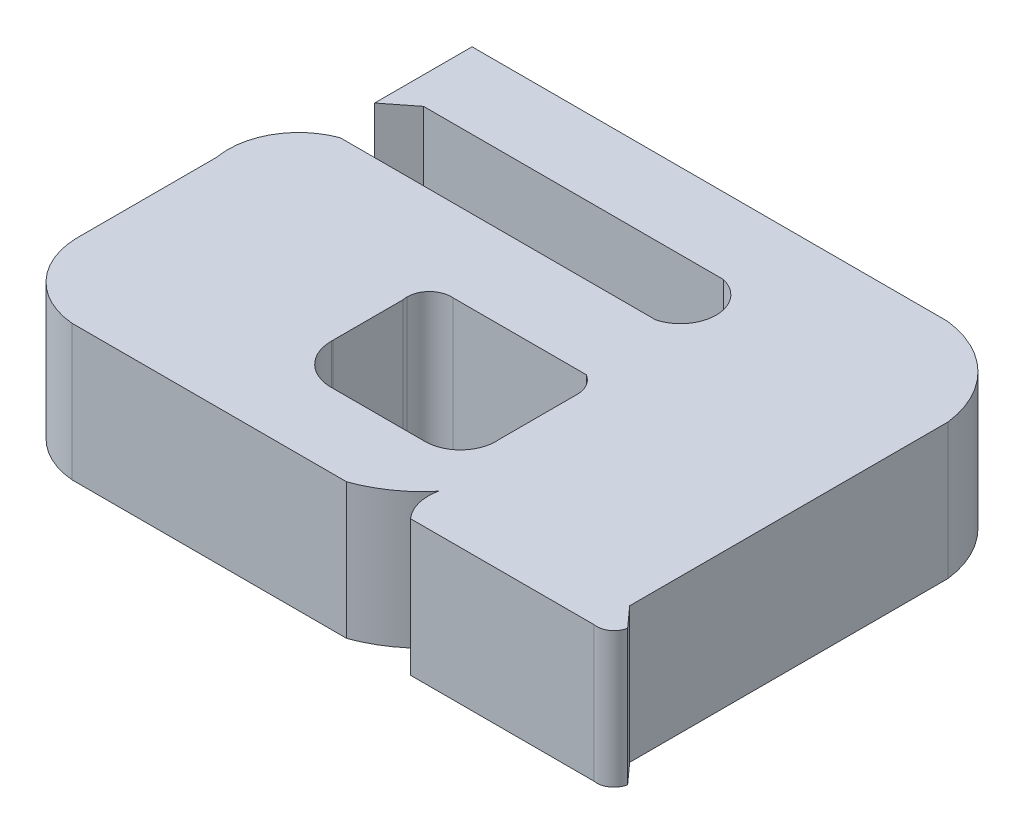
ISO-10303-21;
HEADER;
FILE_DESCRIPTION(('STEP AP214'),'2;1');
FILE_NAME('part.step','',(''),(''),'','','');
FILE_SCHEMA(('AUTOMOTIVE_DESIGN { 1 0 10303 214 1 1 1 1 }'));
ENDSEC;
DATA;
#1=APPLICATION_CONTEXT('core data for automotive mechanical design processes');
#2=APPLICATION_PROTOCOL_DEFINITION('international standard','automotive_design',2000,#1);
#3=PRODUCT_CONTEXT('',#1,'mechanical');
#4=PRODUCT('Part','Part','',(#3));
#5=PRODUCT_RELATED_PRODUCT_CATEGORY('part','',(#4));
#6=PRODUCT_DEFINITION_FORMATION('','',#4);
#7=PRODUCT_DEFINITION_CONTEXT('part definition',#1,'design');
#8=PRODUCT_DEFINITION('design','',#6,#7);
#9=PRODUCT_DEFINITION_SHAPE('','',#8);
#10=(LENGTH_UNIT() NAMED_UNIT(*) SI_UNIT(.MILLI.,.METRE.));
#11=(NAMED_UNIT(*) PLANE_ANGLE_UNIT() SI_UNIT($,.RADIAN.));
#12=(NAMED_UNIT(*) SI_UNIT($,.STERADIAN.) SOLID_ANGLE_UNIT());
#13=UNCERTAINTY_MEASURE_WITH_UNIT(LENGTH_MEASURE(1.E-05),#10,'distance_accuracy_value','');
#14=(GEOMETRIC_REPRESENTATION_CONTEXT(3) GLOBAL_UNCERTAINTY_ASSIGNED_CONTEXT((#13)) GLOBAL_UNIT_ASSIGNED_CONTEXT((#10,
#11,#12)) REPRESENTATION_CONTEXT('',''));
#15=CARTESIAN_POINT('',(0.,0.,0.));
#16=DIRECTION('',(0.,0.,1.));
#17=DIRECTION('',(1.,0.,0.));
#18=AXIS2_PLACEMENT_3D('',#15,#16,#17);
#19=CARTESIAN_POINT('',(64.5742558131211,66.7433443998356,55.477582362577));
#20=DIRECTION('',(0.,1.,0.));
#21=DIRECTION('',(1.,0.,0.));
#22=AXIS2_PLACEMENT_3D('',#19,#20,#21);
#23=PLANE('',#22);
#24=DIRECTION('',(0.,0.,1.));
#25=VECTOR('',#24,1.);
#26=CARTESIAN_POINT('',(65.6989900292125,66.7433443998356,54.5997265658926));
#27=LINE('',#26,#25);
#28=CARTESIAN_POINT('',(65.6989900292125,66.7433443998356,54.5997265658926));
#29=VERTEX_POINT('',#28);
#30=CARTESIAN_POINT('',(65.6989900292125,66.7433443998356,55.1674213470287));
#31=VERTEX_POINT('',#30);
#32=EDGE_CURVE('E383',#29,#31,#27,.T.);
#33=ORIENTED_EDGE('',*,*,#32,.T.);
#34=CARTESIAN_POINT('',(66.0241919260057,66.7433443998356,55.1819307169245));
#35=DIRECTION('',(0.,1.,0.));
#36=DIRECTION('',(1.,0.,0.));
#37=AXIS2_PLACEMENT_3D('',#34,#35,#36);
#38=CIRCLE('',#37,0.325525414510252);
#39=CARTESIAN_POINT('',(65.6986665114955,66.7433443998356,55.1819307169245));
#40=VERTEX_POINT('',#39);
#41=EDGE_CURVE('E290',#31,#40,#38,.T.);
#42=ORIENTED_EDGE('',*,*,#41,.T.);
#43=CARTESIAN_POINT('',(66.0241919260057,66.7433443998356,55.1819307169245));
#44=DIRECTION('',(0.,1.,0.));
#45=DIRECTION('',(1.,0.,0.));
#46=AXIS2_PLACEMENT_3D('',#43,#44,#45);
#47=CIRCLE('',#46,0.325525414510252);
#48=CARTESIAN_POINT('',(66.0447859383238,66.7433443998356,55.5068040493922));
#49=VERTEX_POINT('',#48);
#50=EDGE_CURVE('E11',#40,#49,#47,.T.);
#51=ORIENTED_EDGE('',*,*,#50,.T.);
#52=DIRECTION('',(1.,0.,0.));
#53=VECTOR('',#52,1.);
#54=CARTESIAN_POINT('',(66.0447859383171,66.7433443998356,55.5068040493935));
#55=LINE('',#54,#53);
#56=CARTESIAN_POINT('',(66.7672522095642,66.7433443998356,55.5068040493935));
#57=VERTEX_POINT('',#56);
#58=EDGE_CURVE('E452',#49,#57,#55,.T.);
#59=ORIENTED_EDGE('',*,*,#58,.T.);
#60=CARTESIAN_POINT('',(66.7820270991013,66.7433443998356,55.217643036085));
#61=DIRECTION('',(0.,1.,0.));
#62=DIRECTION('',(1.,0.,0.));
#63=AXIS2_PLACEMENT_3D('',#60,#61,#62);
#64=CIRCLE('',#63,0.289538234053463);
#65=CARTESIAN_POINT('',(67.0698236739014,66.7433443998356,55.1859330926573));
#66=VERTEX_POINT('',#65);
#67=EDGE_CURVE('E442',#57,#66,#64,.T.);
#68=ORIENTED_EDGE('',*,*,#67,.T.);
#69=DIRECTION('',(0.,0.,-1.));
#70=VECTOR('',#69,1.);
#71=CARTESIAN_POINT('',(67.0698236739005,66.7433443998356,55.1859330926564));
#72=LINE('',#71,#70);
#73=CARTESIAN_POINT('',(67.0698236739005,66.7433443998356,54.5750441385026));
#74=VERTEX_POINT('',#73);
#75=EDGE_CURVE('E426',#66,#74,#72,.T.);
#76=ORIENTED_EDGE('',*,*,#75,.T.);
#77=CARTESIAN_POINT('',(66.8608056031624,66.7433443998356,54.5627610008414));
#78=DIRECTION('',(0.,1.,0.));
#79=DIRECTION('',(1.,0.,0.));
#80=AXIS2_PLACEMENT_3D('',#77,#78,#79);
#81=CIRCLE('',#80,0.209378674574559);
#82=CARTESIAN_POINT('',(66.9693292347036,66.7433443998356,54.3837022094803));
#83=VERTEX_POINT('',#82);
#84=EDGE_CURVE('E414',#74,#83,#81,.T.);
#85=ORIENTED_EDGE('',*,*,#84,.T.);
#86=DIRECTION('',(-1.,0.,0.));
#87=VECTOR('',#86,1.);
#88=CARTESIAN_POINT('',(66.9693292347027,66.7433443998356,54.3837022094832));
#89=LINE('',#88,#87);
#90=CARTESIAN_POINT('',(65.8870951940925,66.7433443998356,54.3837022094832));
#91=VERTEX_POINT('',#90);
#92=EDGE_CURVE('E404',#83,#91,#89,.T.);
#93=ORIENTED_EDGE('',*,*,#92,.T.);
#94=CARTESIAN_POINT('',(65.874476109552,66.7433443998356,54.5626233435287));
#95=DIRECTION('',(0.,1.,0.));
#96=DIRECTION('',(1.,0.,0.));
#97=AXIS2_PLACEMENT_3D('',#94,#95,#96);
#98=CIRCLE('',#97,0.179365586171376);
#99=CARTESIAN_POINT('',(65.6951105233806,66.7433443998356,54.5626233435287));
#100=VERTEX_POINT('',#99);
#101=EDGE_CURVE('E342',#91,#100,#98,.T.);
#102=ORIENTED_EDGE('',*,*,#101,.T.);
#103=CARTESIAN_POINT('',(65.874476109552,66.7433443998356,54.5626233435287));
#104=DIRECTION('',(0.,1.,0.));
#105=DIRECTION('',(1.,0.,0.));
#106=AXIS2_PLACEMENT_3D('',#103,#104,#105);
#107=CIRCLE('',#106,0.179365586171376);
#108=EDGE_CURVE('E401',#100,#29,#107,.T.);
#109=ORIENTED_EDGE('',*,*,#108,.T.);
#110=EDGE_LOOP('',(#33,#42,#51,#59,#68,#76,#85,#93,#102,#109));
#111=FACE_BOUND('',#110,.T.);
#112=DIRECTION('',(0.,0.,1.));
#113=VECTOR('',#112,1.);
#114=CARTESIAN_POINT('',(63.9422102820271,66.7433443998356,54.3523550921747));
#115=LINE('',#114,#113);
#116=CARTESIAN_POINT('',(63.9422102820271,66.7433443998356,54.3523550921747));
#117=VERTEX_POINT('',#116);
#118=CARTESIAN_POINT('',(63.9422102820271,66.7433443998356,55.4965245743061));
#119=VERTEX_POINT('',#118);
#120=EDGE_CURVE('E472',#117,#119,#115,.T.);
#121=ORIENTED_EDGE('',*,*,#120,.F.);
#122=CARTESIAN_POINT('',(64.5033690507797,66.7433443998356,54.2518971534337));
#123=DIRECTION('',(0.,1.,0.));
#124=DIRECTION('',(1.,0.,0.));
#125=AXIS2_PLACEMENT_3D('',#122,#123,#124);
#126=CIRCLE('',#125,0.570079784940947);
#127=CARTESIAN_POINT('',(63.9332892658388,66.7433443998356,54.2518971534337));
#128=VERTEX_POINT('',#127);
#129=EDGE_CURVE('E337',#128,#117,#126,.T.);
#130=ORIENTED_EDGE('',*,*,#129,.F.);
#131=CARTESIAN_POINT('',(64.5033690507797,66.7433443998356,54.2518971534337));
#132=DIRECTION('',(0.,1.,0.));
#133=DIRECTION('',(1.,0.,0.));
#134=AXIS2_PLACEMENT_3D('',#131,#132,#133);
#135=CIRCLE('',#134,0.570079784940947);
#136=CARTESIAN_POINT('',(64.3063485343325,66.7433443998356,53.7169449337943));
#137=VERTEX_POINT('',#136);
#138=EDGE_CURVE('E19',#137,#128,#135,.T.);
#139=ORIENTED_EDGE('',*,*,#138,.F.);
#140=DIRECTION('',(-1.,0.,0.));
#141=VECTOR('',#140,1.);
#142=CARTESIAN_POINT('',(66.8653938516462,66.7433443998356,53.7169449337943));
#143=LINE('',#142,#141);
#144=CARTESIAN_POINT('',(66.8653938516475,66.7433443998356,53.7169449337941));
#145=VERTEX_POINT('',#144);
#146=EDGE_CURVE('E388',#145,#137,#143,.T.);
#147=ORIENTED_EDGE('',*,*,#146,.F.);
#148=CARTESIAN_POINT('',(66.7887857003995,66.7433443998356,53.4389638841001));
#149=DIRECTION('',(0.,-1.,0.));
#150=DIRECTION('',(1.,0.,0.));
#151=AXIS2_PLACEMENT_3D('',#148,#149,#150);
#152=CIRCLE('',#151,0.28834401819118);
#153=CARTESIAN_POINT('',(66.8555889512453,66.7433443998356,53.158465045417));
#154=VERTEX_POINT('',#153);
#155=EDGE_CURVE('E306',#154,#145,#152,.T.);
#156=ORIENTED_EDGE('',*,*,#155,.F.);
#157=DIRECTION('',(1.,0.,0.));
#158=VECTOR('',#157,1.);
#159=CARTESIAN_POINT('',(64.4240059355068,66.7433443998356,53.158465045417));
#160=LINE('',#159,#158);
#161=CARTESIAN_POINT('',(64.4240059355068,66.7433443998356,53.158465045417));
#162=VERTEX_POINT('',#161);
#163=EDGE_CURVE('E314',#162,#154,#160,.T.);
#164=ORIENTED_EDGE('',*,*,#163,.F.);
#165=DIRECTION('',(0.786213872145871,0.,-0.617954486386656));
#166=VECTOR('',#165,1.);
#167=CARTESIAN_POINT('',(64.2017485431093,66.7433443998356,53.3331566371461));
#168=LINE('',#167,#166);
#169=CARTESIAN_POINT('',(64.2017485431093,66.7433443998356,53.3331566371461));
#170=VERTEX_POINT('',#169);
#171=EDGE_CURVE('E352',#170,#162,#168,.T.);
#172=ORIENTED_EDGE('',*,*,#171,.F.);
#173=DIRECTION('',(0.,0.,1.));
#174=VECTOR('',#173,1.);
#175=CARTESIAN_POINT('',(64.2017485431093,66.7433443998356,52.5432437431418));
#176=LINE('',#175,#174);
#177=CARTESIAN_POINT('',(64.2017485431093,66.7433443998356,52.5432437431418));
#178=VERTEX_POINT('',#177);
#179=EDGE_CURVE('E365',#178,#170,#176,.T.);
#180=ORIENTED_EDGE('',*,*,#179,.F.);
#181=DIRECTION('',(-1.,0.,0.));
#182=VECTOR('',#181,1.);
#183=CARTESIAN_POINT('',(68.0588655434827,66.7433443998356,52.5432437431418));
#184=LINE('',#183,#182);
#185=CARTESIAN_POINT('',(68.0588655434862,66.7433443998356,52.5432437431438));
#186=VERTEX_POINT('',#185);
#187=EDGE_CURVE('E574',#186,#178,#184,.T.);
#188=ORIENTED_EDGE('',*,*,#187,.F.);
#189=CARTESIAN_POINT('',(67.965238462804,66.7433443998356,53.346243145361));
#190=DIRECTION('',(0.,1.,0.));
#191=DIRECTION('',(1.,0.,0.));
#192=AXIS2_PLACEMENT_3D('',#189,#190,#191);
#193=CIRCLE('',#192,0.808439280464646);
#194=CARTESIAN_POINT('',(68.7675192639315,66.7433443998356,53.2466460252189));
#195=VERTEX_POINT('',#194);
#196=EDGE_CURVE('E456',#195,#186,#193,.T.);
#197=ORIENTED_EDGE('',*,*,#196,.F.);
#198=DIRECTION('',(0.,0.,-1.));
#199=VECTOR('',#198,1.);
#200=CARTESIAN_POINT('',(68.7675192639315,66.7433443998356,55.6532600110186));
#201=LINE('',#200,#199);
#202=CARTESIAN_POINT('',(68.7675192639315,66.7433443998356,55.8305732771997));
#203=VERTEX_POINT('',#202);
#204=EDGE_CURVE('E434',#203,#195,#201,.T.);
#205=ORIENTED_EDGE('',*,*,#204,.F.);
#206=DIRECTION('',(-0.668993054621241,0.,-0.743268654571509));
#207=VECTOR('',#206,1.);
#208=CARTESIAN_POINT('',(68.9169020551852,66.7433443998356,55.9965414371146));
#209=LINE('',#208,#207);
#210=CARTESIAN_POINT('',(68.9169020551923,66.7433443998356,55.9965414371128));
#211=VERTEX_POINT('',#210);
#212=EDGE_CURVE('E553',#211,#203,#209,.T.);
#213=ORIENTED_EDGE('',*,*,#212,.F.);
#214=CARTESIAN_POINT('',(68.7805340847725,66.7433443998356,55.9710019982941));
#215=DIRECTION('',(0.,1.,0.));
#216=DIRECTION('',(1.,0.,0.));
#217=AXIS2_PLACEMENT_3D('',#214,#215,#216);
#218=CIRCLE('',#217,0.138738914121306);
#219=CARTESIAN_POINT('',(68.75736837428,66.7433443998356,56.1077932120097));
#220=VERTEX_POINT('',#219);
#221=EDGE_CURVE('E542',#220,#211,#218,.T.);
#222=ORIENTED_EDGE('',*,*,#221,.F.);
#223=DIRECTION('',(1.,0.,0.));
#224=VECTOR('',#223,1.);
#225=CARTESIAN_POINT('',(67.2673358164444,66.7433443998356,56.1077932120097));
#226=LINE('',#225,#224);
#227=CARTESIAN_POINT('',(67.2673358164511,66.7433443998356,56.1077932120057));
#228=VERTEX_POINT('',#227);
#229=EDGE_CURVE('E397',#228,#220,#226,.T.);
#230=ORIENTED_EDGE('',*,*,#229,.F.);
#231=CARTESIAN_POINT('',(67.5290487823775,66.7433443998356,55.8761310940918));
#232=DIRECTION('',(0.,1.,0.));
#233=DIRECTION('',(1.,0.,0.));
#234=AXIS2_PLACEMENT_3D('',#231,#232,#233);
#235=CIRCLE('',#234,0.349515397958799);
#236=CARTESIAN_POINT('',(67.1795333844187,66.7433443998356,55.8761310940918));
#237=VERTEX_POINT('',#236);
#238=EDGE_CURVE('E312',#237,#228,#235,.T.);
#239=ORIENTED_EDGE('',*,*,#238,.F.);
#240=CARTESIAN_POINT('',(67.5290487823775,66.7433443998356,55.8761310940918));
#241=DIRECTION('',(0.,1.,0.));
#242=DIRECTION('',(1.,0.,0.));
#243=AXIS2_PLACEMENT_3D('',#240,#241,#242);
#244=CIRCLE('',#243,0.349515397958799);
#245=CARTESIAN_POINT('',(67.1878391986119,66.7433443998356,55.8003878874242));
#246=VERTEX_POINT('',#245);
#247=EDGE_CURVE('E394',#246,#237,#244,.T.);
#248=ORIENTED_EDGE('',*,*,#247,.F.);
#249=CARTESIAN_POINT('',(66.4068167221473,66.7433443998356,55.1532003642569));
#250=DIRECTION('',(0.,1.,0.));
#251=DIRECTION('',(1.,0.,0.));
#252=AXIS2_PLACEMENT_3D('',#249,#250,#251);
#253=CIRCLE('',#252,1.0143213489258);
#254=CARTESIAN_POINT('',(66.7497457146509,66.7433443998356,56.1077932120097));
#255=VERTEX_POINT('',#254);
#256=EDGE_CURVE('E517',#255,#246,#253,.T.);
#257=ORIENTED_EDGE('',*,*,#256,.F.);
#258=DIRECTION('',(1.,0.,0.));
#259=VECTOR('',#258,1.);
#260=CARTESIAN_POINT('',(64.5225388331772,66.7433443998356,56.1077932120097));
#261=LINE('',#260,#259);
#262=CARTESIAN_POINT('',(64.5225388331834,66.7433443998356,56.1077932120108));
#263=VERTEX_POINT('',#262);
#264=EDGE_CURVE('E505',#263,#255,#261,.T.);
#265=ORIENTED_EDGE('',*,*,#264,.F.);
#266=CARTESIAN_POINT('',(64.5742558131211,66.7433443998356,55.477582362577));
#267=DIRECTION('',(0.,1.,0.));
#268=DIRECTION('',(1.,0.,0.));
#269=AXIS2_PLACEMENT_3D('',#266,#267,#268);
#270=CIRCLE('',#269,0.632329313536864);
#271=EDGE_CURVE('E487',#119,#263,#270,.T.);
#272=ORIENTED_EDGE('',*,*,#271,.F.);
#273=EDGE_LOOP('',(#121,#130,#139,#147,#156,#164,#172,#180,#188,#197,#205,#213,#222,#230,#239,
#248,#257,#265,#272));
#274=FACE_BOUND('',#273,.T.);
#275=ADVANCED_FACE('F16',(#111,#274),#23,.F.);
#276=CARTESIAN_POINT('',(64.5742558131211,67.8433443998356,55.477582362577));
#277=DIRECTION('',(0.,1.,0.));
#278=DIRECTION('',(1.,0.,0.));
#279=AXIS2_PLACEMENT_3D('',#276,#277,#278);
#280=PLANE('',#279);
#281=DIRECTION('',(0.,0.,1.));
#282=VECTOR('',#281,1.);
#283=CARTESIAN_POINT('',(65.6989900292125,67.8433443998356,54.5997265658926));
#284=LINE('',#283,#282);
#285=CARTESIAN_POINT('',(65.6989900292125,67.8433443998356,54.5997265658926));
#286=VERTEX_POINT('',#285);
#287=CARTESIAN_POINT('',(65.6989900292125,67.8433443998356,55.1674213470287));
#288=VERTEX_POINT('',#287);
#289=EDGE_CURVE('E271',#286,#288,#284,.T.);
#290=ORIENTED_EDGE('',*,*,#289,.F.);
#291=CARTESIAN_POINT('',(65.874476109552,67.8433443998356,54.5626233435287));
#292=DIRECTION('',(0.,1.,0.));
#293=DIRECTION('',(0.,0.,1.));
#294=AXIS2_PLACEMENT_3D('',#291,#292,#293);
#295=CIRCLE('',#294,0.179365586171369);
#296=CARTESIAN_POINT('',(65.6951105233806,67.8433443998356,54.5626233435287));
#297=VERTEX_POINT('',#296);
#298=EDGE_CURVE('E282',#297,#286,#295,.T.);
#299=ORIENTED_EDGE('',*,*,#298,.F.);
#300=CARTESIAN_POINT('',(65.874476109552,67.8433443998356,54.5626233435287));
#301=DIRECTION('',(0.,1.,0.));
#302=DIRECTION('',(0.,0.,1.));
#303=AXIS2_PLACEMENT_3D('',#300,#301,#302);
#304=CIRCLE('',#303,0.179365586171369);
#305=CARTESIAN_POINT('',(65.8870951940925,67.8433443998356,54.3837022094832));
#306=VERTEX_POINT('',#305);
#307=EDGE_CURVE('E343',#306,#297,#304,.T.);
#308=ORIENTED_EDGE('',*,*,#307,.F.);
#309=DIRECTION('',(-1.,0.,0.));
#310=VECTOR('',#309,1.);
#311=CARTESIAN_POINT('',(66.9693292347027,67.8433443998356,54.3837022094832));
#312=LINE('',#311,#310);
#313=CARTESIAN_POINT('',(66.9693292347036,67.8433443998356,54.3837022094803));
#314=VERTEX_POINT('',#313);
#315=EDGE_CURVE('E411',#314,#306,#312,.T.);
#316=ORIENTED_EDGE('',*,*,#315,.F.);
#317=CARTESIAN_POINT('',(66.8608056031624,67.8433443998356,54.5627610008414));
#318=DIRECTION('',(0.,1.,0.));
#319=DIRECTION('',(0.,0.,1.));
#320=AXIS2_PLACEMENT_3D('',#317,#318,#319);
#321=CIRCLE('',#320,0.209378674574559);
#322=CARTESIAN_POINT('',(67.0698236739005,67.8433443998356,54.5750441385026));
#323=VERTEX_POINT('',#322);
#324=EDGE_CURVE('E423',#323,#314,#321,.T.);
#325=ORIENTED_EDGE('',*,*,#324,.F.);
#326=DIRECTION('',(0.,0.,-1.));
#327=VECTOR('',#326,1.);
#328=CARTESIAN_POINT('',(67.0698236739005,67.8433443998356,55.1859330926564));
#329=LINE('',#328,#327);
#330=CARTESIAN_POINT('',(67.0698236739014,67.8433443998356,55.1859330926573));
#331=VERTEX_POINT('',#330);
#332=EDGE_CURVE('E439',#331,#323,#329,.T.);
#333=ORIENTED_EDGE('',*,*,#332,.F.);
#334=CARTESIAN_POINT('',(66.7820270991013,67.8433443998356,55.217643036085));
#335=DIRECTION('',(0.,1.,0.));
#336=DIRECTION('',(0.,0.,1.));
#337=AXIS2_PLACEMENT_3D('',#334,#335,#336);
#338=CIRCLE('',#337,0.28953823405347);
#339=CARTESIAN_POINT('',(66.7672522095642,67.8433443998356,55.5068040493935));
#340=VERTEX_POINT('',#339);
#341=EDGE_CURVE('E449',#340,#331,#338,.T.);
#342=ORIENTED_EDGE('',*,*,#341,.F.);
#343=DIRECTION('',(1.,0.,0.));
#344=VECTOR('',#343,1.);
#345=CARTESIAN_POINT('',(66.0447859383171,67.8433443998356,55.5068040493935));
#346=LINE('',#345,#344);
#347=CARTESIAN_POINT('',(66.0447859383238,67.8433443998356,55.5068040493922));
#348=VERTEX_POINT('',#347);
#349=EDGE_CURVE('E465',#348,#340,#346,.T.);
#350=ORIENTED_EDGE('',*,*,#349,.F.);
#351=CARTESIAN_POINT('',(66.0241919260057,67.8433443998356,55.1819307169245));
#352=DIRECTION('',(0.,1.,0.));
#353=DIRECTION('',(0.,0.,1.));
#354=AXIS2_PLACEMENT_3D('',#351,#352,#353);
#355=CIRCLE('',#354,0.325525414510252);
#356=CARTESIAN_POINT('',(65.6986665114955,67.8433443998356,55.1819307169245));
#357=VERTEX_POINT('',#356);
#358=EDGE_CURVE('E25',#357,#348,#355,.T.);
#359=ORIENTED_EDGE('',*,*,#358,.F.);
#360=CARTESIAN_POINT('',(66.0241919260057,67.8433443998356,55.1819307169245));
#361=DIRECTION('',(0.,1.,0.));
#362=DIRECTION('',(0.,0.,1.));
#363=AXIS2_PLACEMENT_3D('',#360,#361,#362);
#364=CIRCLE('',#363,0.325525414510252);
#365=EDGE_CURVE('E288',#288,#357,#364,.T.);
#366=ORIENTED_EDGE('',*,*,#365,.F.);
#367=EDGE_LOOP('',(#290,#299,#308,#316,#325,#333,#342,#350,#359,#366));
#368=FACE_BOUND('',#367,.T.);
#369=DIRECTION('',(0.,0.,1.));
#370=VECTOR('',#369,1.);
#371=CARTESIAN_POINT('',(63.9422102820271,67.8433443998356,54.3523550921747));
#372=LINE('',#371,#370);
#373=CARTESIAN_POINT('',(63.9422102820271,67.8433443998356,54.3523550921747));
#374=VERTEX_POINT('',#373);
#375=CARTESIAN_POINT('',(63.9422102820271,67.8433443998356,55.4965245743061));
#376=VERTEX_POINT('',#375);
#377=EDGE_CURVE('E483',#374,#376,#372,.T.);
#378=ORIENTED_EDGE('',*,*,#377,.T.);
#379=CARTESIAN_POINT('',(64.5742558131211,67.8433443998356,55.477582362577));
#380=DIRECTION('',(0.,1.,0.));
#381=DIRECTION('',(0.,0.,1.));
#382=AXIS2_PLACEMENT_3D('',#379,#380,#381);
#383=CIRCLE('',#382,0.632329313536871);
#384=CARTESIAN_POINT('',(64.5225388331834,67.8433443998356,56.1077932120108));
#385=VERTEX_POINT('',#384);
#386=EDGE_CURVE('E501',#376,#385,#383,.T.);
#387=ORIENTED_EDGE('',*,*,#386,.T.);
#388=DIRECTION('',(1.,0.,0.));
#389=VECTOR('',#388,1.);
#390=CARTESIAN_POINT('',(64.5225388331772,67.8433443998356,56.1077932120097));
#391=LINE('',#390,#389);
#392=CARTESIAN_POINT('',(66.7497457146509,67.8433443998356,56.1077932120097));
#393=VERTEX_POINT('',#392);
#394=EDGE_CURVE('E513',#385,#393,#391,.T.);
#395=ORIENTED_EDGE('',*,*,#394,.T.);
#396=CARTESIAN_POINT('',(66.4068167221473,67.8433443998356,55.1532003642569));
#397=DIRECTION('',(0.,1.,0.));
#398=DIRECTION('',(0.,0.,1.));
#399=AXIS2_PLACEMENT_3D('',#396,#397,#398);
#400=CIRCLE('',#399,1.0143213489258);
#401=CARTESIAN_POINT('',(67.1878391986119,67.8433443998356,55.8003878874242));
#402=VERTEX_POINT('',#401);
#403=EDGE_CURVE('E525',#393,#402,#400,.T.);
#404=ORIENTED_EDGE('',*,*,#403,.T.);
#405=CARTESIAN_POINT('',(67.5290487823775,67.8433443998356,55.8761310940918));
#406=DIRECTION('',(0.,1.,0.));
#407=DIRECTION('',(0.,0.,1.));
#408=AXIS2_PLACEMENT_3D('',#405,#406,#407);
#409=CIRCLE('',#408,0.349515397958792);
#410=CARTESIAN_POINT('',(67.1795333844187,67.8433443998356,55.8761310940918));
#411=VERTEX_POINT('',#410);
#412=EDGE_CURVE('E398',#402,#411,#409,.T.);
#413=ORIENTED_EDGE('',*,*,#412,.T.);
#414=CARTESIAN_POINT('',(67.5290487823775,67.8433443998356,55.8761310940918));
#415=DIRECTION('',(0.,1.,0.));
#416=DIRECTION('',(0.,0.,1.));
#417=AXIS2_PLACEMENT_3D('',#414,#415,#416);
#418=CIRCLE('',#417,0.349515397958792);
#419=CARTESIAN_POINT('',(67.2673358164511,67.8433443998356,56.1077932120057));
#420=VERTEX_POINT('',#419);
#421=EDGE_CURVE('E313',#411,#420,#418,.T.);
#422=ORIENTED_EDGE('',*,*,#421,.T.);
#423=DIRECTION('',(1.,0.,0.));
#424=VECTOR('',#423,1.);
#425=CARTESIAN_POINT('',(67.2673358164444,67.8433443998356,56.1077932120097));
#426=LINE('',#425,#424);
#427=CARTESIAN_POINT('',(68.75736837428,67.8433443998356,56.1077932120097));
#428=VERTEX_POINT('',#427);
#429=EDGE_CURVE('E538',#420,#428,#426,.T.);
#430=ORIENTED_EDGE('',*,*,#429,.T.);
#431=CARTESIAN_POINT('',(68.7805340847725,67.8433443998356,55.9710019982941));
#432=DIRECTION('',(0.,1.,0.));
#433=DIRECTION('',(0.,0.,1.));
#434=AXIS2_PLACEMENT_3D('',#431,#432,#433);
#435=CIRCLE('',#434,0.138738914121299);
#436=CARTESIAN_POINT('',(68.9169020551923,67.8433443998356,55.9965414371128));
#437=VERTEX_POINT('',#436);
#438=EDGE_CURVE('E550',#428,#437,#435,.T.);
#439=ORIENTED_EDGE('',*,*,#438,.T.);
#440=DIRECTION('',(-0.668993054621241,0.,-0.743268654571509));
#441=VECTOR('',#440,1.);
#442=CARTESIAN_POINT('',(68.9169020551852,67.8433443998356,55.9965414371146));
#443=LINE('',#442,#441);
#444=CARTESIAN_POINT('',(68.7675192639315,67.8433443998356,55.8305732771997));
#445=VERTEX_POINT('',#444);
#446=EDGE_CURVE('E430',#437,#445,#443,.T.);
#447=ORIENTED_EDGE('',*,*,#446,.T.);
#448=DIRECTION('',(0.,0.,-1.));
#449=VECTOR('',#448,1.);
#450=CARTESIAN_POINT('',(68.7675192639315,67.8433443998356,55.6532600110186));
#451=LINE('',#450,#449);
#452=CARTESIAN_POINT('',(68.7675192639315,67.8433443998356,53.2466460252189));
#453=VERTEX_POINT('',#452);
#454=EDGE_CURVE('E461',#445,#453,#451,.T.);
#455=ORIENTED_EDGE('',*,*,#454,.T.);
#456=CARTESIAN_POINT('',(67.965238462804,67.8433443998356,53.346243145361));
#457=DIRECTION('',(0.,1.,0.));
#458=DIRECTION('',(0.,0.,1.));
#459=AXIS2_PLACEMENT_3D('',#456,#457,#458);
#460=CIRCLE('',#459,0.808439280464646);
#461=CARTESIAN_POINT('',(68.0588655434862,67.8433443998356,52.5432437431438));
#462=VERTEX_POINT('',#461);
#463=EDGE_CURVE('E469',#453,#462,#460,.T.);
#464=ORIENTED_EDGE('',*,*,#463,.T.);
#465=DIRECTION('',(-1.,0.,0.));
#466=VECTOR('',#465,1.);
#467=CARTESIAN_POINT('',(68.0588655434827,67.8433443998356,52.5432437431418));
#468=LINE('',#467,#466);
#469=CARTESIAN_POINT('',(64.2017485431093,67.8433443998356,52.5432437431418));
#470=VERTEX_POINT('',#469);
#471=EDGE_CURVE('E361',#462,#470,#468,.T.);
#472=ORIENTED_EDGE('',*,*,#471,.T.);
#473=DIRECTION('',(0.,0.,1.));
#474=VECTOR('',#473,1.);
#475=CARTESIAN_POINT('',(64.2017485431093,67.8433443998356,52.5432437431418));
#476=LINE('',#475,#474);
#477=CARTESIAN_POINT('',(64.2017485431093,67.8433443998356,53.3331566371461));
#478=VERTEX_POINT('',#477);
#479=EDGE_CURVE('E348',#470,#478,#476,.T.);
#480=ORIENTED_EDGE('',*,*,#479,.T.);
#481=DIRECTION('',(0.786213872145872,0.,-0.617954486386656));
#482=VECTOR('',#481,1.);
#483=CARTESIAN_POINT('',(64.2017485431093,67.8433443998356,53.3331566371461));
#484=LINE('',#483,#482);
#485=CARTESIAN_POINT('',(64.4240059355068,67.8433443998356,53.158465045417));
#486=VERTEX_POINT('',#485);
#487=EDGE_CURVE('E319',#478,#486,#484,.T.);
#488=ORIENTED_EDGE('',*,*,#487,.T.);
#489=DIRECTION('',(1.,0.,0.));
#490=VECTOR('',#489,1.);
#491=CARTESIAN_POINT('',(64.4240059355068,67.8433443998356,53.158465045417));
#492=LINE('',#491,#490);
#493=CARTESIAN_POINT('',(66.8555889512453,67.8433443998356,53.158465045417));
#494=VERTEX_POINT('',#493);
#495=EDGE_CURVE('E328',#486,#494,#492,.T.);
#496=ORIENTED_EDGE('',*,*,#495,.T.);
#497=CARTESIAN_POINT('',(66.7887857003995,67.8433443998356,53.4389638841001));
#498=DIRECTION('',(0.,-1.,0.));
#499=DIRECTION('',(0.,0.,1.));
#500=AXIS2_PLACEMENT_3D('',#497,#498,#499);
#501=CIRCLE('',#500,0.28834401819118);
#502=CARTESIAN_POINT('',(66.8653938516475,67.8433443998356,53.7169449337941));
#503=VERTEX_POINT('',#502);
#504=EDGE_CURVE('E384',#494,#503,#501,.T.);
#505=ORIENTED_EDGE('',*,*,#504,.T.);
#506=DIRECTION('',(-1.,0.,0.));
#507=VECTOR('',#506,1.);
#508=CARTESIAN_POINT('',(66.8653938516462,67.8433443998356,53.7169449337943));
#509=LINE('',#508,#507);
#510=CARTESIAN_POINT('',(64.3063485343325,67.8433443998356,53.7169449337943));
#511=VERTEX_POINT('',#510);
#512=EDGE_CURVE('E479',#503,#511,#509,.T.);
#513=ORIENTED_EDGE('',*,*,#512,.T.);
#514=CARTESIAN_POINT('',(64.5033690507797,67.8433443998356,54.2518971534337));
#515=DIRECTION('',(0.,1.,0.));
#516=DIRECTION('',(0.,0.,1.));
#517=AXIS2_PLACEMENT_3D('',#514,#515,#516);
#518=CIRCLE('',#517,0.570079784940947);
#519=CARTESIAN_POINT('',(63.9332892658388,67.8433443998356,54.2518971534337));
#520=VERTEX_POINT('',#519);
#521=EDGE_CURVE('E37',#511,#520,#518,.T.);
#522=ORIENTED_EDGE('',*,*,#521,.T.);
#523=CARTESIAN_POINT('',(64.5033690507797,67.8433443998356,54.2518971534337));
#524=DIRECTION('',(0.,1.,0.));
#525=DIRECTION('',(0.,0.,1.));
#526=AXIS2_PLACEMENT_3D('',#523,#524,#525);
#527=CIRCLE('',#526,0.570079784940947);
#528=EDGE_CURVE('E292',#520,#374,#527,.T.);
#529=ORIENTED_EDGE('',*,*,#528,.T.);
#530=EDGE_LOOP('',(#378,#387,#395,#404,#413,#422,#430,#439,#447,#455,#464,#472,#480,#488,#496,
#505,#513,#522,#529));
#531=FACE_BOUND('',#530,.T.);
#532=ADVANCED_FACE('F294',(#368,#531),#280,.T.);
#533=CARTESIAN_POINT('',(66.0241919260057,67.7433443998356,55.1819307169245));
#534=DIRECTION('',(0.,-1.,0.));
#535=DIRECTION('',(-1.,0.,0.));
#536=AXIS2_PLACEMENT_3D('',#533,#534,#535);
#537=CYLINDRICAL_SURFACE('',#536,0.325525414510252);
#538=DIRECTION('',(0.,-1.,0.));
#539=VECTOR('',#538,1.);
#540=CARTESIAN_POINT('',(65.6986665114955,67.7433443998356,55.1819307169245));
#541=LINE('',#540,#539);
#542=EDGE_CURVE('E299',#357,#40,#541,.T.);
#543=ORIENTED_EDGE('',*,*,#542,.F.);
#544=ORIENTED_EDGE('',*,*,#358,.T.);
#545=DIRECTION('',(0.,-1.,0.));
#546=VECTOR('',#545,1.);
#547=CARTESIAN_POINT('',(66.0447859383238,67.7433443998356,55.5068040493922));
#548=LINE('',#547,#546);
#549=EDGE_CURVE('E455',#348,#49,#548,.T.);
#550=ORIENTED_EDGE('',*,*,#549,.T.);
#551=ORIENTED_EDGE('',*,*,#50,.F.);
#552=EDGE_LOOP('',(#543,#544,#550,#551));
#553=FACE_BOUND('',#552,.T.);
#554=ADVANCED_FACE('F678',(#553),#537,.F.);
#555=CARTESIAN_POINT('',(64.5033690507797,67.7433443998356,54.2518971534337));
#556=DIRECTION('',(0.,-1.,0.));
#557=DIRECTION('',(-1.,0.,0.));
#558=AXIS2_PLACEMENT_3D('',#555,#556,#557);
#559=CYLINDRICAL_SURFACE('',#558,0.570079784940947);
#560=DIRECTION('',(0.,-1.,0.));
#561=VECTOR('',#560,1.);
#562=CARTESIAN_POINT('',(63.9332892658388,67.7433443998356,54.2518971534337));
#563=LINE('',#562,#561);
#564=EDGE_CURVE('E333',#520,#128,#563,.T.);
#565=ORIENTED_EDGE('',*,*,#564,.F.);
#566=ORIENTED_EDGE('',*,*,#521,.F.);
#567=DIRECTION('',(0.,-1.,0.));
#568=VECTOR('',#567,1.);
#569=CARTESIAN_POINT('',(64.3063485343325,67.7433443998356,53.7169449337943));
#570=LINE('',#569,#568);
#571=EDGE_CURVE('E495',#511,#137,#570,.T.);
#572=ORIENTED_EDGE('',*,*,#571,.T.);
#573=ORIENTED_EDGE('',*,*,#138,.T.);
#574=EDGE_LOOP('',(#565,#566,#572,#573));
#575=FACE_BOUND('',#574,.T.);
#576=ADVANCED_FACE('F605',(#575),#559,.T.);
#577=CARTESIAN_POINT('',(66.8653938516462,67.7433443998356,53.7169449337943));
#578=DIRECTION('',(0.,0.,1.));
#579=DIRECTION('',(1.,0.,0.));
#580=AXIS2_PLACEMENT_3D('',#577,#578,#579);
#581=PLANE('',#580);
#582=ORIENTED_EDGE('',*,*,#146,.T.);
#583=ORIENTED_EDGE('',*,*,#571,.F.);
#584=ORIENTED_EDGE('',*,*,#512,.F.);
#585=DIRECTION('',(0.,-1.,0.));
#586=VECTOR('',#585,1.);
#587=CARTESIAN_POINT('',(66.8653938516475,67.7433443998356,53.7169449337941));
#588=LINE('',#587,#586);
#589=EDGE_CURVE('E389',#503,#145,#588,.T.);
#590=ORIENTED_EDGE('',*,*,#589,.T.);
#591=EDGE_LOOP('',(#582,#583,#584,#590));
#592=FACE_BOUND('',#591,.T.);
#593=ADVANCED_FACE('F604',(#592),#581,.F.);
#594=CARTESIAN_POINT('',(66.7887857003995,67.7433443998356,53.4389638841001));
#595=DIRECTION('',(0.,-1.,0.));
#596=DIRECTION('',(-1.,0.,0.));
#597=AXIS2_PLACEMENT_3D('',#594,#595,#596);
#598=CYLINDRICAL_SURFACE('',#597,0.28834401819118);
#599=ORIENTED_EDGE('',*,*,#155,.T.);
#600=ORIENTED_EDGE('',*,*,#589,.F.);
#601=ORIENTED_EDGE('',*,*,#504,.F.);
#602=DIRECTION('',(0.,-1.,0.));
#603=VECTOR('',#602,1.);
#604=CARTESIAN_POINT('',(66.8555889512453,67.7433443998356,53.158465045417));
#605=LINE('',#604,#603);
#606=EDGE_CURVE('E318',#494,#154,#605,.T.);
#607=ORIENTED_EDGE('',*,*,#606,.T.);
#608=EDGE_LOOP('',(#599,#600,#601,#607));
#609=FACE_BOUND('',#608,.T.);
#610=ADVANCED_FACE('F659',(#609),#598,.F.);
#611=CARTESIAN_POINT('',(64.4240059355068,67.7433443998356,53.158465045417));
#612=DIRECTION('',(0.,0.,-1.));
#613=DIRECTION('',(0.,-1.,0.));
#614=AXIS2_PLACEMENT_3D('',#611,#612,#613);
#615=PLANE('',#614);
#616=ORIENTED_EDGE('',*,*,#163,.T.);
#617=ORIENTED_EDGE('',*,*,#606,.F.);
#618=ORIENTED_EDGE('',*,*,#495,.F.);
#619=DIRECTION('',(0.,-1.,0.));
#620=VECTOR('',#619,1.);
#621=CARTESIAN_POINT('',(64.4240059355068,67.7433443998356,53.158465045417));
#622=LINE('',#621,#620);
#623=EDGE_CURVE('E376',#486,#162,#622,.T.);
#624=ORIENTED_EDGE('',*,*,#623,.T.);
#625=EDGE_LOOP('',(#616,#617,#618,#624));
#626=FACE_BOUND('',#625,.T.);
#627=ADVANCED_FACE('F655',(#626),#615,.F.);
#628=CARTESIAN_POINT('',(64.2017485431093,67.7433443998356,53.3331566371461));
#629=DIRECTION('',(-0.617954486386656,0.,-0.786213872145871));
#630=DIRECTION('',(-0.786213872145871,0.,0.617954486386656));
#631=AXIS2_PLACEMENT_3D('',#628,#629,#630);
#632=PLANE('',#631);
#633=ORIENTED_EDGE('',*,*,#171,.T.);
#634=ORIENTED_EDGE('',*,*,#623,.F.);
#635=ORIENTED_EDGE('',*,*,#487,.F.);
#636=DIRECTION('',(0.,-1.,0.));
#637=VECTOR('',#636,1.);
#638=CARTESIAN_POINT('',(64.2017485431093,67.7433443998356,53.3331566371461));
#639=LINE('',#638,#637);
#640=EDGE_CURVE('E353',#478,#170,#639,.T.);
#641=ORIENTED_EDGE('',*,*,#640,.T.);
#642=EDGE_LOOP('',(#633,#634,#635,#641));
#643=FACE_BOUND('',#642,.T.);
#644=ADVANCED_FACE('F653',(#643),#632,.F.);
#645=CARTESIAN_POINT('',(64.2017485431093,67.7433443998356,52.5432437431418));
#646=DIRECTION('',(1.,0.,0.));
#647=DIRECTION('',(0.,1.,0.));
#648=AXIS2_PLACEMENT_3D('',#645,#646,#647);
#649=PLANE('',#648);
#650=ORIENTED_EDGE('',*,*,#179,.T.);
#651=ORIENTED_EDGE('',*,*,#640,.F.);
#652=ORIENTED_EDGE('',*,*,#479,.F.);
#653=DIRECTION('',(0.,-1.,0.));
#654=VECTOR('',#653,1.);
#655=CARTESIAN_POINT('',(64.2017485431093,67.7433443998356,52.5432437431418));
#656=LINE('',#655,#654);
#657=EDGE_CURVE('E366',#470,#178,#656,.T.);
#658=ORIENTED_EDGE('',*,*,#657,.T.);
#659=EDGE_LOOP('',(#650,#651,#652,#658));
#660=FACE_BOUND('',#659,.T.);
#661=ADVANCED_FACE('F651',(#660),#649,.F.);
#662=CARTESIAN_POINT('',(68.0588655434827,67.7433443998356,52.5432437431418));
#663=DIRECTION('',(0.,0.,1.));
#664=DIRECTION('',(1.,0.,0.));
#665=AXIS2_PLACEMENT_3D('',#662,#663,#664);
#666=PLANE('',#665);
#667=ORIENTED_EDGE('',*,*,#187,.T.);
#668=ORIENTED_EDGE('',*,*,#657,.F.);
#669=ORIENTED_EDGE('',*,*,#471,.F.);
#670=DIRECTION('',(0.,-1.,0.));
#671=VECTOR('',#670,1.);
#672=CARTESIAN_POINT('',(68.0588655434862,67.7433443998356,52.5432437431438));
#673=LINE('',#672,#671);
#674=EDGE_CURVE('E460',#462,#186,#673,.T.);
#675=ORIENTED_EDGE('',*,*,#674,.T.);
#676=EDGE_LOOP('',(#667,#668,#669,#675));
#677=FACE_BOUND('',#676,.T.);
#678=ADVANCED_FACE('F646',(#677),#666,.F.);
#679=CARTESIAN_POINT('',(67.965238462804,67.7433443998356,53.346243145361));
#680=DIRECTION('',(0.,-1.,0.));
#681=DIRECTION('',(-1.,0.,0.));
#682=AXIS2_PLACEMENT_3D('',#679,#680,#681);
#683=CYLINDRICAL_SURFACE('',#682,0.808439280464646);
#684=ORIENTED_EDGE('',*,*,#196,.T.);
#685=ORIENTED_EDGE('',*,*,#674,.F.);
#686=ORIENTED_EDGE('',*,*,#463,.F.);
#687=DIRECTION('',(0.,-1.,0.));
#688=VECTOR('',#687,1.);
#689=CARTESIAN_POINT('',(68.7675192639315,67.7433443998356,53.2466460252189));
#690=LINE('',#689,#688);
#691=EDGE_CURVE('E564',#453,#195,#690,.T.);
#692=ORIENTED_EDGE('',*,*,#691,.T.);
#693=EDGE_LOOP('',(#684,#685,#686,#692));
#694=FACE_BOUND('',#693,.T.);
#695=ADVANCED_FACE('F644',(#694),#683,.T.);
#696=CARTESIAN_POINT('',(68.7675192639315,67.7433443998356,55.6532600110186));
#697=DIRECTION('',(-1.,0.,0.));
#698=DIRECTION('',(0.,0.,1.));
#699=AXIS2_PLACEMENT_3D('',#696,#697,#698);
#700=PLANE('',#699);
#701=ORIENTED_EDGE('',*,*,#204,.T.);
#702=ORIENTED_EDGE('',*,*,#691,.F.);
#703=ORIENTED_EDGE('',*,*,#454,.F.);
#704=DIRECTION('',(0.,-1.,0.));
#705=VECTOR('',#704,1.);
#706=CARTESIAN_POINT('',(68.7675192639315,67.7433443998356,55.8305732771997));
#707=LINE('',#706,#705);
#708=EDGE_CURVE('E435',#445,#203,#707,.T.);
#709=ORIENTED_EDGE('',*,*,#708,.T.);
#710=EDGE_LOOP('',(#701,#702,#703,#709));
#711=FACE_BOUND('',#710,.T.);
#712=ADVANCED_FACE('F642',(#711),#700,.F.);
#713=CARTESIAN_POINT('',(68.9169020551852,67.7433443998356,55.9965414371146));
#714=DIRECTION('',(-0.743268654571509,0.,0.668993054621241));
#715=DIRECTION('',(0.,1.,0.));
#716=AXIS2_PLACEMENT_3D('',#713,#714,#715);
#717=PLANE('',#716);
#718=ORIENTED_EDGE('',*,*,#212,.T.);
#719=ORIENTED_EDGE('',*,*,#708,.F.);
#720=ORIENTED_EDGE('',*,*,#446,.F.);
#721=DIRECTION('',(0.,-1.,0.));
#722=VECTOR('',#721,1.);
#723=CARTESIAN_POINT('',(68.9169020551923,67.7433443998356,55.9965414371128));
#724=LINE('',#723,#722);
#725=EDGE_CURVE('E546',#437,#211,#724,.T.);
#726=ORIENTED_EDGE('',*,*,#725,.T.);
#727=EDGE_LOOP('',(#718,#719,#720,#726));
#728=FACE_BOUND('',#727,.T.);
#729=ADVANCED_FACE('F637',(#728),#717,.F.);
#730=CARTESIAN_POINT('',(68.7805340847725,67.7433443998356,55.9710019982941));
#731=DIRECTION('',(0.,-1.,0.));
#732=DIRECTION('',(-1.,0.,0.));
#733=AXIS2_PLACEMENT_3D('',#730,#731,#732);
#734=CYLINDRICAL_SURFACE('',#733,0.138738914121306);
#735=ORIENTED_EDGE('',*,*,#221,.T.);
#736=ORIENTED_EDGE('',*,*,#725,.F.);
#737=ORIENTED_EDGE('',*,*,#438,.F.);
#738=DIRECTION('',(0.,-1.,0.));
#739=VECTOR('',#738,1.);
#740=CARTESIAN_POINT('',(68.75736837428,67.7433443998356,56.1077932120097));
#741=LINE('',#740,#739);
#742=EDGE_CURVE('E534',#428,#220,#741,.T.);
#743=ORIENTED_EDGE('',*,*,#742,.T.);
#744=EDGE_LOOP('',(#735,#736,#737,#743));
#745=FACE_BOUND('',#744,.T.);
#746=ADVANCED_FACE('F635',(#745),#734,.T.);
#747=CARTESIAN_POINT('',(67.2673358164444,67.7433443998356,56.1077932120097));
#748=DIRECTION('',(0.,0.,-1.));
#749=DIRECTION('',(0.,-1.,0.));
#750=AXIS2_PLACEMENT_3D('',#747,#748,#749);
#751=PLANE('',#750);
#752=ORIENTED_EDGE('',*,*,#229,.T.);
#753=ORIENTED_EDGE('',*,*,#742,.F.);
#754=ORIENTED_EDGE('',*,*,#429,.F.);
#755=DIRECTION('',(0.,-1.,0.));
#756=VECTOR('',#755,1.);
#757=CARTESIAN_POINT('',(67.2673358164511,67.7433443998356,56.1077932120057));
#758=LINE('',#757,#756);
#759=EDGE_CURVE('E325',#420,#228,#758,.T.);
#760=ORIENTED_EDGE('',*,*,#759,.T.);
#761=EDGE_LOOP('',(#752,#753,#754,#760));
#762=FACE_BOUND('',#761,.T.);
#763=ADVANCED_FACE('F633',(#762),#751,.F.);
#764=CARTESIAN_POINT('',(67.5290487823775,67.7433443998356,55.8761310940918));
#765=DIRECTION('',(0.,-1.,0.));
#766=DIRECTION('',(-1.,0.,0.));
#767=AXIS2_PLACEMENT_3D('',#764,#765,#766);
#768=CYLINDRICAL_SURFACE('',#767,0.349515397958799);
#769=DIRECTION('',(0.,-1.,0.));
#770=VECTOR('',#769,1.);
#771=CARTESIAN_POINT('',(67.1795333844187,67.7433443998356,55.8761310940918));
#772=LINE('',#771,#770);
#773=EDGE_CURVE('E308',#411,#237,#772,.T.);
#774=ORIENTED_EDGE('',*,*,#773,.F.);
#775=ORIENTED_EDGE('',*,*,#412,.F.);
#776=DIRECTION('',(0.,-1.,0.));
#777=VECTOR('',#776,1.);
#778=CARTESIAN_POINT('',(67.1878391986119,67.7433443998356,55.8003878874242));
#779=LINE('',#778,#777);
#780=EDGE_CURVE('E521',#402,#246,#779,.T.);
#781=ORIENTED_EDGE('',*,*,#780,.T.);
#782=ORIENTED_EDGE('',*,*,#247,.T.);
#783=EDGE_LOOP('',(#774,#775,#781,#782));
#784=FACE_BOUND('',#783,.T.);
#785=ADVANCED_FACE('F624',(#784),#768,.T.);
#786=CARTESIAN_POINT('',(66.4068167221473,67.7433443998356,55.1532003642569));
#787=DIRECTION('',(0.,-1.,0.));
#788=DIRECTION('',(-1.,0.,0.));
#789=AXIS2_PLACEMENT_3D('',#786,#787,#788);
#790=CYLINDRICAL_SURFACE('',#789,1.0143213489258);
#791=ORIENTED_EDGE('',*,*,#256,.T.);
#792=ORIENTED_EDGE('',*,*,#780,.F.);
#793=ORIENTED_EDGE('',*,*,#403,.F.);
#794=DIRECTION('',(0.,-1.,0.));
#795=VECTOR('',#794,1.);
#796=CARTESIAN_POINT('',(66.7497457146509,67.7433443998356,56.1077932120097));
#797=LINE('',#796,#795);
#798=EDGE_CURVE('E509',#393,#255,#797,.T.);
#799=ORIENTED_EDGE('',*,*,#798,.T.);
#800=EDGE_LOOP('',(#791,#792,#793,#799));
#801=FACE_BOUND('',#800,.T.);
#802=ADVANCED_FACE('F622',(#801),#790,.T.);
#803=CARTESIAN_POINT('',(64.5225388331772,67.7433443998356,56.1077932120097));
#804=DIRECTION('',(0.,0.,-1.));
#805=DIRECTION('',(0.,-1.,0.));
#806=AXIS2_PLACEMENT_3D('',#803,#804,#805);
#807=PLANE('',#806);
#808=ORIENTED_EDGE('',*,*,#264,.T.);
#809=ORIENTED_EDGE('',*,*,#798,.F.);
#810=ORIENTED_EDGE('',*,*,#394,.F.);
#811=DIRECTION('',(0.,-1.,0.));
#812=VECTOR('',#811,1.);
#813=CARTESIAN_POINT('',(64.5225388331834,67.7433443998356,56.1077932120108));
#814=LINE('',#813,#812);
#815=EDGE_CURVE('E494',#385,#263,#814,.T.);
#816=ORIENTED_EDGE('',*,*,#815,.T.);
#817=EDGE_LOOP('',(#808,#809,#810,#816));
#818=FACE_BOUND('',#817,.T.);
#819=ADVANCED_FACE('F617',(#818),#807,.F.);
#820=CARTESIAN_POINT('',(64.5742558131211,67.7433443998356,55.477582362577));
#821=DIRECTION('',(0.,-1.,0.));
#822=DIRECTION('',(-1.,0.,0.));
#823=AXIS2_PLACEMENT_3D('',#820,#821,#822);
#824=CYLINDRICAL_SURFACE('',#823,0.632329313536864);
#825=ORIENTED_EDGE('',*,*,#271,.T.);
#826=ORIENTED_EDGE('',*,*,#815,.F.);
#827=ORIENTED_EDGE('',*,*,#386,.F.);
#828=DIRECTION('',(0.,-1.,0.));
#829=VECTOR('',#828,1.);
#830=CARTESIAN_POINT('',(63.9422102820271,67.7433443998356,55.4965245743061));
#831=LINE('',#830,#829);
#832=EDGE_CURVE('E476',#376,#119,#831,.T.);
#833=ORIENTED_EDGE('',*,*,#832,.T.);
#834=EDGE_LOOP('',(#825,#826,#827,#833));
#835=FACE_BOUND('',#834,.T.);
#836=ADVANCED_FACE('F615',(#835),#824,.T.);
#837=CARTESIAN_POINT('',(63.9422102820271,67.7433443998356,54.3523550921747));
#838=DIRECTION('',(1.,0.,0.));
#839=DIRECTION('',(0.,1.,0.));
#840=AXIS2_PLACEMENT_3D('',#837,#838,#839);
#841=PLANE('',#840);
#842=ORIENTED_EDGE('',*,*,#120,.T.);
#843=ORIENTED_EDGE('',*,*,#832,.F.);
#844=ORIENTED_EDGE('',*,*,#377,.F.);
#845=DIRECTION('',(0.,-1.,0.));
#846=VECTOR('',#845,1.);
#847=CARTESIAN_POINT('',(63.9422102820271,67.7433443998356,54.3523550921747));
#848=LINE('',#847,#846);
#849=EDGE_CURVE('E347',#374,#117,#848,.T.);
#850=ORIENTED_EDGE('',*,*,#849,.T.);
#851=EDGE_LOOP('',(#842,#843,#844,#850));
#852=FACE_BOUND('',#851,.T.);
#853=ADVANCED_FACE('F613',(#852),#841,.F.);
#854=CARTESIAN_POINT('',(66.0447859383171,67.7433443998356,55.5068040493935));
#855=DIRECTION('',(0.,0.,-1.));
#856=DIRECTION('',(0.,-1.,0.));
#857=AXIS2_PLACEMENT_3D('',#854,#855,#856);
#858=PLANE('',#857);
#859=ORIENTED_EDGE('',*,*,#58,.F.);
#860=ORIENTED_EDGE('',*,*,#549,.F.);
#861=ORIENTED_EDGE('',*,*,#349,.T.);
#862=DIRECTION('',(0.,-1.,0.));
#863=VECTOR('',#862,1.);
#864=CARTESIAN_POINT('',(66.7672522095642,67.7433443998356,55.5068040493935));
#865=LINE('',#864,#863);
#866=EDGE_CURVE('E445',#340,#57,#865,.T.);
#867=ORIENTED_EDGE('',*,*,#866,.T.);
#868=EDGE_LOOP('',(#859,#860,#861,#867));
#869=FACE_BOUND('',#868,.T.);
#870=ADVANCED_FACE('F710',(#869),#858,.T.);
#871=CARTESIAN_POINT('',(66.7820270991013,67.7433443998356,55.217643036085));
#872=DIRECTION('',(0.,-1.,0.));
#873=DIRECTION('',(-1.,0.,0.));
#874=AXIS2_PLACEMENT_3D('',#871,#872,#873);
#875=CYLINDRICAL_SURFACE('',#874,0.289538234053463);
#876=ORIENTED_EDGE('',*,*,#67,.F.);
#877=ORIENTED_EDGE('',*,*,#866,.F.);
#878=ORIENTED_EDGE('',*,*,#341,.T.);
#879=DIRECTION('',(0.,-1.,0.));
#880=VECTOR('',#879,1.);
#881=CARTESIAN_POINT('',(67.0698236739014,67.7433443998356,55.1859330926573));
#882=LINE('',#881,#880);
#883=EDGE_CURVE('E429',#331,#66,#882,.T.);
#884=ORIENTED_EDGE('',*,*,#883,.T.);
#885=EDGE_LOOP('',(#876,#877,#878,#884));
#886=FACE_BOUND('',#885,.T.);
#887=ADVANCED_FACE('F707',(#886),#875,.F.);
#888=CARTESIAN_POINT('',(67.0698236739005,67.7433443998356,55.1859330926564));
#889=DIRECTION('',(-1.,0.,0.));
#890=DIRECTION('',(0.,0.,1.));
#891=AXIS2_PLACEMENT_3D('',#888,#889,#890);
#892=PLANE('',#891);
#893=ORIENTED_EDGE('',*,*,#75,.F.);
#894=ORIENTED_EDGE('',*,*,#883,.F.);
#895=ORIENTED_EDGE('',*,*,#332,.T.);
#896=DIRECTION('',(0.,-1.,0.));
#897=VECTOR('',#896,1.);
#898=CARTESIAN_POINT('',(67.0698236739005,67.7433443998356,54.5750441385026));
#899=LINE('',#898,#897);
#900=EDGE_CURVE('E419',#323,#74,#899,.T.);
#901=ORIENTED_EDGE('',*,*,#900,.T.);
#902=EDGE_LOOP('',(#893,#894,#895,#901));
#903=FACE_BOUND('',#902,.T.);
#904=ADVANCED_FACE('F704',(#903),#892,.T.);
#905=CARTESIAN_POINT('',(66.8608056031624,67.7433443998356,54.5627610008414));
#906=DIRECTION('',(0.,-1.,0.));
#907=DIRECTION('',(-1.,0.,0.));
#908=AXIS2_PLACEMENT_3D('',#905,#906,#907);
#909=CYLINDRICAL_SURFACE('',#908,0.209378674574559);
#910=ORIENTED_EDGE('',*,*,#84,.F.);
#911=ORIENTED_EDGE('',*,*,#900,.F.);
#912=ORIENTED_EDGE('',*,*,#324,.T.);
#913=DIRECTION('',(0.,-1.,0.));
#914=VECTOR('',#913,1.);
#915=CARTESIAN_POINT('',(66.9693292347036,67.7433443998356,54.3837022094803));
#916=LINE('',#915,#914);
#917=EDGE_CURVE('E407',#314,#83,#916,.T.);
#918=ORIENTED_EDGE('',*,*,#917,.T.);
#919=EDGE_LOOP('',(#910,#911,#912,#918));
#920=FACE_BOUND('',#919,.T.);
#921=ADVANCED_FACE('F696',(#920),#909,.F.);
#922=CARTESIAN_POINT('',(66.9693292347027,67.7433443998356,54.3837022094832));
#923=DIRECTION('',(0.,0.,1.));
#924=DIRECTION('',(1.,0.,0.));
#925=AXIS2_PLACEMENT_3D('',#922,#923,#924);
#926=PLANE('',#925);
#927=ORIENTED_EDGE('',*,*,#92,.F.);
#928=ORIENTED_EDGE('',*,*,#917,.F.);
#929=ORIENTED_EDGE('',*,*,#315,.T.);
#930=DIRECTION('',(0.,-1.,0.));
#931=VECTOR('',#930,1.);
#932=CARTESIAN_POINT('',(65.8870951940925,67.7433443998356,54.3837022094832));
#933=LINE('',#932,#931);
#934=EDGE_CURVE('E357',#306,#91,#933,.T.);
#935=ORIENTED_EDGE('',*,*,#934,.T.);
#936=EDGE_LOOP('',(#927,#928,#929,#935));
#937=FACE_BOUND('',#936,.T.);
#938=ADVANCED_FACE('F693',(#937),#926,.T.);
#939=CARTESIAN_POINT('',(65.874476109552,67.7433443998356,54.5626233435287));
#940=DIRECTION('',(0.,-1.,0.));
#941=DIRECTION('',(-1.,0.,0.));
#942=AXIS2_PLACEMENT_3D('',#939,#940,#941);
#943=CYLINDRICAL_SURFACE('',#942,0.179365586171376);
#944=DIRECTION('',(0.,-1.,0.));
#945=VECTOR('',#944,1.);
#946=CARTESIAN_POINT('',(65.6951105233806,67.7433443998356,54.5626233435287));
#947=LINE('',#946,#945);
#948=EDGE_CURVE('E338',#297,#100,#947,.T.);
#949=ORIENTED_EDGE('',*,*,#948,.F.);
#950=ORIENTED_EDGE('',*,*,#298,.T.);
#951=DIRECTION('',(0.,-1.,0.));
#952=VECTOR('',#951,1.);
#953=CARTESIAN_POINT('',(65.6989900292125,67.7433443998356,54.5997265658926));
#954=LINE('',#953,#952);
#955=EDGE_CURVE('E278',#286,#29,#954,.T.);
#956=ORIENTED_EDGE('',*,*,#955,.T.);
#957=ORIENTED_EDGE('',*,*,#108,.F.);
#958=EDGE_LOOP('',(#949,#950,#956,#957));
#959=FACE_BOUND('',#958,.T.);
#960=ADVANCED_FACE('F683',(#959),#943,.F.);
#961=CARTESIAN_POINT('',(65.6989900292125,67.7433443998356,54.5997265658926));
#962=DIRECTION('',(1.,0.,0.));
#963=DIRECTION('',(0.,1.,0.));
#964=AXIS2_PLACEMENT_3D('',#961,#962,#963);
#965=PLANE('',#964);
#966=ORIENTED_EDGE('',*,*,#32,.F.);
#967=ORIENTED_EDGE('',*,*,#955,.F.);
#968=ORIENTED_EDGE('',*,*,#289,.T.);
#969=DIRECTION('',(0.,-1.,0.));
#970=VECTOR('',#969,1.);
#971=CARTESIAN_POINT('',(65.6989900292125,67.7433443998356,55.1674213470287));
#972=LINE('',#971,#970);
#973=EDGE_CURVE('E275',#288,#31,#972,.T.);
#974=ORIENTED_EDGE('',*,*,#973,.T.);
#975=EDGE_LOOP('',(#966,#967,#968,#974));
#976=FACE_BOUND('',#975,.T.);
#977=ADVANCED_FACE('F274',(#976),#965,.T.);
#978=CARTESIAN_POINT('',(65.874476109552,67.7433443998356,54.5626233435287));
#979=DIRECTION('',(0.,-1.,0.));
#980=DIRECTION('',(-1.,0.,0.));
#981=AXIS2_PLACEMENT_3D('',#978,#979,#980);
#982=CYLINDRICAL_SURFACE('',#981,0.179365586171376);
#983=ORIENTED_EDGE('',*,*,#307,.T.);
#984=ORIENTED_EDGE('',*,*,#948,.T.);
#985=ORIENTED_EDGE('',*,*,#101,.F.);
#986=ORIENTED_EDGE('',*,*,#934,.F.);
#987=EDGE_LOOP('',(#983,#984,#985,#986));
#988=FACE_BOUND('',#987,.T.);
#989=ADVANCED_FACE('F690',(#988),#982,.F.);
#990=CARTESIAN_POINT('',(67.5290487823775,67.7433443998356,55.8761310940918));
#991=DIRECTION('',(0.,-1.,0.));
#992=DIRECTION('',(-1.,0.,0.));
#993=AXIS2_PLACEMENT_3D('',#990,#991,#992);
#994=CYLINDRICAL_SURFACE('',#993,0.349515397958799);
#995=ORIENTED_EDGE('',*,*,#421,.F.);
#996=ORIENTED_EDGE('',*,*,#773,.T.);
#997=ORIENTED_EDGE('',*,*,#238,.T.);
#998=ORIENTED_EDGE('',*,*,#759,.F.);
#999=EDGE_LOOP('',(#995,#996,#997,#998));
#1000=FACE_BOUND('',#999,.T.);
#1001=ADVANCED_FACE('F629',(#1000),#994,.T.);
#1002=CARTESIAN_POINT('',(64.5033690507797,67.7433443998356,54.2518971534337));
#1003=DIRECTION('',(0.,-1.,0.));
#1004=DIRECTION('',(-1.,0.,0.));
#1005=AXIS2_PLACEMENT_3D('',#1002,#1003,#1004);
#1006=CYLINDRICAL_SURFACE('',#1005,0.570079784940947);
#1007=ORIENTED_EDGE('',*,*,#528,.F.);
#1008=ORIENTED_EDGE('',*,*,#564,.T.);
#1009=ORIENTED_EDGE('',*,*,#129,.T.);
#1010=ORIENTED_EDGE('',*,*,#849,.F.);
#1011=EDGE_LOOP('',(#1007,#1008,#1009,#1010));
#1012=FACE_BOUND('',#1011,.T.);
#1013=ADVANCED_FACE('F609',(#1012),#1006,.T.);
#1014=CARTESIAN_POINT('',(66.0241919260057,67.7433443998356,55.1819307169245));
#1015=DIRECTION('',(0.,-1.,0.));
#1016=DIRECTION('',(-1.,0.,0.));
#1017=AXIS2_PLACEMENT_3D('',#1014,#1015,#1016);
#1018=CYLINDRICAL_SURFACE('',#1017,0.325525414510252);
#1019=ORIENTED_EDGE('',*,*,#365,.T.);
#1020=ORIENTED_EDGE('',*,*,#542,.T.);
#1021=ORIENTED_EDGE('',*,*,#41,.F.);
#1022=ORIENTED_EDGE('',*,*,#973,.F.);
#1023=EDGE_LOOP('',(#1019,#1020,#1021,#1022));
#1024=FACE_BOUND('',#1023,.T.);
#1025=ADVANCED_FACE('F286',(#1024),#1018,.F.);
#1026=CLOSED_SHELL('',(#275,#532,#554,#576,#593,#610,#627,#644,#661,#678,#695,#712,#729,#746,
#763,#785,#802,#819,#836,#853,#870,#887,#904,#921,#938,#960,#977,#989,#1001,#1013,#1025));
#1027=MANIFOLD_SOLID_BREP('B1',#1026);
#1028=ADVANCED_BREP_SHAPE_REPRESENTATION('',(#18,#1027),#14);
#1029=SHAPE_DEFINITION_REPRESENTATION(#9,#1028);
ENDSEC;
END-ISO-10303-21;
